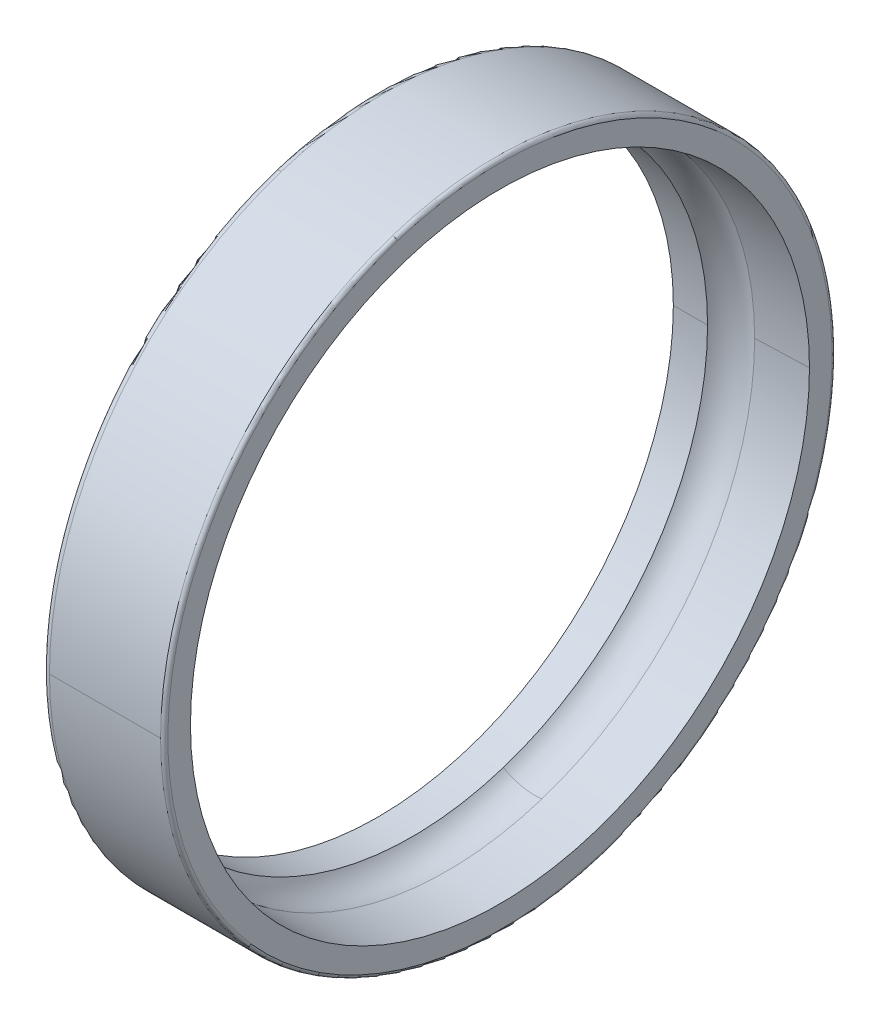
ISO-10303-21;
HEADER;
FILE_DESCRIPTION(('STEP AP214'),'2;1');
FILE_NAME('part.step','',(''),(''),'','','');
FILE_SCHEMA(('AUTOMOTIVE_DESIGN { 1 0 10303 214 1 1 1 1 }'));
ENDSEC;
DATA;
#1=APPLICATION_CONTEXT('core data for automotive mechanical design processes');
#2=APPLICATION_PROTOCOL_DEFINITION('international standard','automotive_design',2000,#1);
#3=PRODUCT_CONTEXT('',#1,'mechanical');
#4=PRODUCT('Part','Part','',(#3));
#5=PRODUCT_RELATED_PRODUCT_CATEGORY('part','',(#4));
#6=PRODUCT_DEFINITION_FORMATION('','',#4);
#7=PRODUCT_DEFINITION_CONTEXT('part definition',#1,'design');
#8=PRODUCT_DEFINITION('design','',#6,#7);
#9=PRODUCT_DEFINITION_SHAPE('','',#8);
#10=(LENGTH_UNIT() NAMED_UNIT(*) SI_UNIT(.MILLI.,.METRE.));
#11=(NAMED_UNIT(*) PLANE_ANGLE_UNIT() SI_UNIT($,.RADIAN.));
#12=(NAMED_UNIT(*) SI_UNIT($,.STERADIAN.) SOLID_ANGLE_UNIT());
#13=UNCERTAINTY_MEASURE_WITH_UNIT(LENGTH_MEASURE(1.E-05),#10,'distance_accuracy_value','');
#14=(GEOMETRIC_REPRESENTATION_CONTEXT(3) GLOBAL_UNCERTAINTY_ASSIGNED_CONTEXT((#13)) GLOBAL_UNIT_ASSIGNED_CONTEXT((#10,
#11,#12)) REPRESENTATION_CONTEXT('',''));
#15=CARTESIAN_POINT('',(0.,0.,0.));
#16=DIRECTION('',(0.,0.,1.));
#17=DIRECTION('',(1.,0.,0.));
#18=AXIS2_PLACEMENT_3D('',#15,#16,#17);
#19=CARTESIAN_POINT('',(0.599999999999874,0.,0.));
#20=DIRECTION('',(1.,0.,0.));
#21=DIRECTION('',(0.,-0.309016994374947,0.951056516295154));
#22=AXIS2_PLACEMENT_3D('',#19,#20,#21);
#23=TOROIDAL_SURFACE('',#22,26.9,0.599999999999875);
#24=CARTESIAN_POINT('',(0.599999999999874,-25.5834202883396,-8.31255714868608));
#25=DIRECTION('',(0.,0.309016994374946,-0.951056516295154));
#26=DIRECTION('',(2.09832151654199E-13,-0.951056516295154,-0.309016994374946));
#27=AXIS2_PLACEMENT_3D('',#24,#25,#26);
#28=CIRCLE('',#27,0.599999999999874);
#29=CARTESIAN_POINT('',(0.6,-26.1540541981166,-8.49796734531101));
#30=VERTEX_POINT('',#29);
#31=CARTESIAN_POINT('',(0.,-25.5834202883396,-8.31255714868608));
#32=VERTEX_POINT('',#31);
#33=EDGE_CURVE('E11',#30,#32,#28,.T.);
#34=ORIENTED_EDGE('',*,*,#33,.T.);
#35=CARTESIAN_POINT('',(0.,-25.5834202883396,-8.31255714868615));
#36=CARTESIAN_POINT('',(0.,-25.4474151324198,-8.7311681921886));
#37=CARTESIAN_POINT('',(0.,-25.3011185990981,-9.14643452912641));
#38=CARTESIAN_POINT('',(0.,-24.988333583264,-9.9692919597601));
#39=CARTESIAN_POINT('',(0.,-24.8218451007517,-10.376883053456));
#40=CARTESIAN_POINT('',(0.,-24.4690669921501,-11.1834041674931));
#41=CARTESIAN_POINT('',(0.,-24.2827773660608,-11.5823341878344));
#42=CARTESIAN_POINT('',(0.,-23.890848512775,-12.3705731448039));
#43=CARTESIAN_POINT('',(0.,-23.6852092855786,-12.7598820814321));
#44=CARTESIAN_POINT('',(0.,-23.2550758949378,-13.5279407111042));
#45=CARTESIAN_POINT('',(0.,-23.0305817314935,-13.906690404148));
#46=CARTESIAN_POINT('',(0.,-22.5632794922202,-14.6527181806377));
#47=CARTESIAN_POINT('',(0.,-22.3204714163913,-15.0199962640835));
#48=CARTESIAN_POINT('',(0.,-21.8171262452813,-15.7421959961621));
#49=CARTESIAN_POINT('',(0.,-21.5565891500002,-16.097117644795));
#50=CARTESIAN_POINT('',(0.,-21.0184136108673,-16.7937494753058));
#51=CARTESIAN_POINT('',(0.,-20.7407751670155,-17.1354596571838));
#52=CARTESIAN_POINT('',(0.,-20.1690657822661,-17.8048453429802));
#53=CARTESIAN_POINT('',(0.,-19.8749948413686,-18.1325208468987));
#54=CARTESIAN_POINT('',(0.,-19.2711289062015,-18.7730477781738));
#55=CARTESIAN_POINT('',(0.,-18.9613339119318,-19.0858992055303));
#56=CARTESIAN_POINT('',(0.,-18.3267661930233,-19.6960242970867));
#57=CARTESIAN_POINT('',(0.,-18.0019934683845,-19.9932979612866));
#58=CARTESIAN_POINT('',(0.,-17.3382526947511,-20.5715513682621));
#59=CARTESIAN_POINT('',(0.,-16.9992846457566,-20.8525311110378));
#60=CARTESIAN_POINT('',(0.,-16.3079698271124,-21.3975197703463));
#61=CARTESIAN_POINT('',(0.,-15.9556230574628,-21.6615286868792));
#62=CARTESIAN_POINT('',(0.,-15.2383996317436,-22.1719396730998));
#63=CARTESIAN_POINT('',(0.,-14.8735229756741,-22.4183417427874));
#64=CARTESIAN_POINT('',(0.,-14.1321187969377,-22.8929454311488));
#65=CARTESIAN_POINT('',(0.,-13.7555912742708,-23.1211470498226));
#66=CARTESIAN_POINT('',(0.,-12.991792450122,-23.5588000784689));
#67=CARTESIAN_POINT('',(0.,-12.6045211486401,-23.7682514884414));
#68=CARTESIAN_POINT('',(0.,-11.8201677373475,-24.1678995128928));
#69=CARTESIAN_POINT('',(0.,-11.4230856275367,-24.3580961273716));
#70=CARTESIAN_POINT('',(0.,-10.6200672051692,-24.7187763605321));
#71=CARTESIAN_POINT('',(0.,-10.2141308926125,-24.8892599792138));
#72=CARTESIAN_POINT('',(0.,-9.39438200088572,-25.2101035108099));
#73=CARTESIAN_POINT('',(0.,-8.98056942171572,-25.3604634237243));
#74=CARTESIAN_POINT('',(0.,-8.1460649075114,-25.6406973135858));
#75=CARTESIAN_POINT('',(0.,-7.72537297247708,-25.7705712905328));
#76=CARTESIAN_POINT('',(0.,-6.87812323026387,-26.0095204306734));
#77=CARTESIAN_POINT('',(0.,-6.45156542308499,-26.118595593867));
#78=CARTESIAN_POINT('',(0.,-5.59361155170219,-26.3156843348786));
#79=CARTESIAN_POINT('',(0.,-5.16221548749829,-26.4036979126967));
#80=CARTESIAN_POINT('',(0.,-4.29562437296996,-26.5584514505394));
#81=CARTESIAN_POINT('',(0.,-3.86042932264553,-26.625191410564));
#82=CARTESIAN_POINT('',(0.,-2.98728865887098,-26.7372369304103));
#83=CARTESIAN_POINT('',(0.,-2.54934304542085,-26.7825424902319));
#84=CARTESIAN_POINT('',(0.,-1.67175630473719,-26.8516100646104));
#85=CARTESIAN_POINT('',(0.,-1.23211517750366,-26.8753720791672));
#86=CARTESIAN_POINT('',(0.,-0.352196543236725,-26.9012953182416));
#87=CARTESIAN_POINT('',(0.,0.0880809637966727,-26.9034565427592));
#88=CARTESIAN_POINT('',(0.,0.96821169058515,-26.8861729951759));
#89=CARTESIAN_POINT('',(0.,1.40806491034023,-26.8667282230751));
#90=CARTESIAN_POINT('',(0.,2.28628741763908,-26.8062795264143));
#91=CARTESIAN_POINT('',(0.,2.72465670518286,-26.7652756018543));
#92=CARTESIAN_POINT('',(0.,3.5988552780488,-26.6618073823208));
#93=CARTESIAN_POINT('',(0.,4.03468456337097,-26.5993430873473));
#94=CARTESIAN_POINT('',(0.,4.90275318087121,-26.4531046089447));
#95=CARTESIAN_POINT('',(0.,5.33499251304929,-26.3693304255156));
#96=CARTESIAN_POINT('',(0.,6.19483992185044,-26.1806739895474));
#97=CARTESIAN_POINT('',(0.,6.62244799847352,-26.0757917370082));
#98=CARTESIAN_POINT('',(0.,7.47200275085404,-25.845171833353));
#99=CARTESIAN_POINT('',(0.,7.89394942661148,-25.7194341822369));
#100=CARTESIAN_POINT('',(0.,8.73116487076068,-25.4474063944424));
#101=CARTESIAN_POINT('',(0.,9.14643363915243,-25.3011162577641));
#102=CARTESIAN_POINT('',(0.,9.96929284973394,-24.988335924598));
#103=CARTESIAN_POINT('',(0.,10.3768832919237,-24.8218457281103));
#104=CARTESIAN_POINT('',(0.,11.1834039290253,-24.4690663647916));
#105=CARTESIAN_POINT('',(0.,11.5823341239371,-24.2827771979606));
#106=CARTESIAN_POINT('',(0.,12.3705732087011,-23.8908486808753));
#107=CARTESIAN_POINT('',(0.,12.7598820985533,-23.6852093306209));
#108=CARTESIAN_POINT('',(0.,13.5279406939829,-23.2550758498956));
#109=CARTESIAN_POINT('',(0.,13.9066903995603,-23.0305817194245));
#110=CARTESIAN_POINT('',(0.,14.6527181852252,-22.5632795042893));
#111=CARTESIAN_POINT('',(0.,15.0199962653127,-22.3204714196252));
#112=CARTESIAN_POINT('',(0.,15.7421959949328,-21.8171262420474));
#113=CARTESIAN_POINT('',(0.,16.0971176444656,-21.5565891491337));
#114=CARTESIAN_POINT('',(0.,16.7937494756351,-21.0184136117338));
#115=CARTESIAN_POINT('',(0.,17.135459657272,-20.7407751672477));
#116=CARTESIAN_POINT('',(0.,17.8048453428919,-20.169065782034));
#117=CARTESIAN_POINT('',(0.,18.132520846875,-19.8749948413064));
#118=CARTESIAN_POINT('',(0.,18.7730477781974,-19.2711289062637));
#119=CARTESIAN_POINT('',(0.,19.0858992055366,-18.9613339119485));
#120=CARTESIAN_POINT('',(0.,19.6960242970804,-18.3267661930067));
#121=CARTESIAN_POINT('',(0.,19.9932979612848,-18.0019934683801));
#122=CARTESIAN_POINT('',(0.,20.5715513682637,-17.3382526947556));
#123=CARTESIAN_POINT('',(0.,20.8525311110382,-16.9992846457578));
#124=CARTESIAN_POINT('',(0.,21.3975197703459,-16.3079698271113));
#125=CARTESIAN_POINT('',(0.,21.6615286868791,-15.9556230574625));
#126=CARTESIAN_POINT('',(0.,22.1719396730998,-15.238399631744));
#127=CARTESIAN_POINT('',(0.,22.4183417427874,-14.8735229756742));
#128=CARTESIAN_POINT('',(0.,22.8929454311488,-14.1321187969377));
#129=CARTESIAN_POINT('',(0.,23.1211470498226,-13.7555912742708));
#130=CARTESIAN_POINT('',(0.,23.5588000784689,-12.9917924501221));
#131=CARTESIAN_POINT('',(0.,23.7682514884414,-12.6045211486402));
#132=CARTESIAN_POINT('',(0.,24.1678995128928,-11.8201677373475));
#133=CARTESIAN_POINT('',(0.,24.3580961273716,-11.4230856275368));
#134=CARTESIAN_POINT('',(0.,24.7187763605321,-10.6200672051693));
#135=CARTESIAN_POINT('',(0.,24.8892599792139,-10.2141308926125));
#136=CARTESIAN_POINT('',(0.,25.2101035108098,-9.39438200088582));
#137=CARTESIAN_POINT('',(0.,25.3604634237239,-8.98056942171588));
#138=CARTESIAN_POINT('',(0.,25.6406973135861,-8.14606490751138));
#139=CARTESIAN_POINT('',(0.,25.770571290534,-7.72537297247681));
#140=CARTESIAN_POINT('',(0.,26.0095204306722,-6.87812323026428));
#141=CARTESIAN_POINT('',(0.,26.1185955938624,-6.45156542308631));
#142=CARTESIAN_POINT('',(0.,26.3156843348832,-5.59361155170101));
#143=CARTESIAN_POINT('',(0.,26.4036979127139,-5.16221548749369));
#144=CARTESIAN_POINT('',(0.,26.5584514505222,-4.2956243729747));
#145=CARTESIAN_POINT('',(0.,26.6251914104998,-3.86042932266304));
#146=CARTESIAN_POINT('',(0.,26.7372369304745,-2.98728865885362));
#147=CARTESIAN_POINT('',(0.,26.7825424904716,-2.54934304535585));
#148=CARTESIAN_POINT('',(0.,26.8516100643707,-1.67175630480234));
#149=CARTESIAN_POINT('',(0.,26.8753720782725,-1.2321151777466));
#150=CARTESIAN_POINT('',(0.,26.9012953191362,-0.352196542993962));
#151=CARTESIAN_POINT('',(0.,26.903456546098,0.0880809647029341));
#152=CARTESIAN_POINT('',(0.,26.8861729918371,0.968211689678711));
#153=CARTESIAN_POINT('',(0.,26.8667282106145,1.40806490695759));
#154=CARTESIAN_POINT('',(0.,26.8062795388749,2.28628742102156));
#155=CARTESIAN_POINT('',(0.,26.7652756483579,2.72465671780665));
#156=CARTESIAN_POINT('',(0.,26.6618073358172,3.59885526542489));
#157=CARTESIAN_POINT('',(0.,26.5993429137935,4.03468451625804));
#158=CARTESIAN_POINT('',(0.,26.4531047824985,4.90275322798401));
#159=CARTESIAN_POINT('',(0.,26.3693310732272,5.33499268887683));
#160=CARTESIAN_POINT('',(0.,26.1806733418358,6.19483974602276));
#161=CARTESIAN_POINT('',(0.,26.0757893197157,6.62244734227587));
#162=CARTESIAN_POINT('',(0.,25.8451742506456,7.47200340705155));
#163=CARTESIAN_POINT('',(0.,25.7194432036955,7.89395187557412));
#164=CARTESIAN_POINT('',(0.,25.5834202883397,8.31255714868601));
#165=B_SPLINE_CURVE_WITH_KNOTS('',3,(#35,#36,#37,#38,#39,#40,#41,#42,#43,#44,#45,#46,#47,#48,
#49,#50,#51,#52,#53,#54,#55,#56,#57,#58,#59,#60,#61,#62,#63,#64,#65,#66,#67,#68,#69,#70,#71,#72,
#73,#74,#75,#76,#77,#78,#79,#80,#81,#82,#83,#84,#85,#86,#87,#88,#89,#90,#91,#92,#93,#94,#95,#96,
#97,#98,#99,#100,#101,#102,#103,#104,#105,#106,#107,#108,#109,#110,#111,#112,#113,#114,#115,
#116,#117,#118,#119,#120,#121,#122,#123,#124,#125,#126,#127,#128,#129,#130,#131,#132,#133,#134,
#135,#136,#137,#138,#139,#140,#141,#142,#143,#144,#145,#146,#147,#148,#149,#150,#151,#152,#153,
#154,#155,#156,#157,#158,#159,#160,#161,#162,#163,#164),.UNSPECIFIED.,.F.,.F.,(4,2,2,2,2,2,2,2,
2,2,2,2,2,2,2,2,2,2,2,2,2,2,2,2,2,2,2,2,2,2,2,2,2,2,2,2,2,2,2,2,2,2,2,2,2,2,2,2,2,2,2,2,2,2,2,2,
2,2,2,2,2,2,2,2,4),(0.,1.32031809453268,2.64063618906536,3.96095428359803,5.28127237813072,
6.60159047266339,7.92190856719607,9.24222666172875,10.5625447562614,11.8828628507941,
13.2031809453268,14.5234990398595,15.8438171343921,17.1641352289248,18.4844533234575,
19.8047714179902,21.1250895125229,22.4454076070555,23.7657257015882,25.0860437961209,
26.4063618906536,27.7266799851863,29.0469980797189,30.3673161742516,31.6876342687843,
33.007952363317,34.3282704578497,35.6485885523823,36.968906646915,38.2892247414477,
39.6095428359804,40.9298609305131,42.2501790250457,43.5704971195784,44.8908152141111,
46.2111333086438,47.5314514031765,48.8517694977091,50.1720875922418,51.4924056867745,
52.8127237813072,54.1330418758398,55.4533599703725,56.7736780649052,58.0939961594379,
59.4143142539706,60.7346323485032,62.0549504430359,63.3752685375686,64.6955866321013,
66.015904726634,67.3362228211666,68.6565409156993,69.976859010232,71.2971771047647,
72.6174951992973,73.93781329383,75.2581313883627,76.5784494828954,77.898767577428,
79.2190856719607,80.5394037664934,81.8597218610261,83.1800399555588,84.5003580500914),.UNSPECIFIED.);
#166=CARTESIAN_POINT('',(0.,25.5834202883396,8.31255714868608));
#167=VERTEX_POINT('',#166);
#168=EDGE_CURVE('E26',#32,#167,#165,.T.);
#169=ORIENTED_EDGE('',*,*,#168,.T.);
#170=CARTESIAN_POINT('',(0.599999999999874,25.5834202883396,8.31255714868608));
#171=DIRECTION('',(0.,-0.309016994374946,0.951056516295154));
#172=DIRECTION('',(2.09832151654199E-13,0.951056516295154,0.309016994374946));
#173=AXIS2_PLACEMENT_3D('',#170,#171,#172);
#174=CIRCLE('',#173,0.599999999999874);
#175=CARTESIAN_POINT('',(0.6,26.1540541981166,8.49796734531101));
#176=VERTEX_POINT('',#175);
#177=EDGE_CURVE('E299',#176,#167,#174,.T.);
#178=ORIENTED_EDGE('',*,*,#177,.F.);
#179=CARTESIAN_POINT('',(0.6,0.,0.));
#180=DIRECTION('',(1.,0.,0.));
#181=DIRECTION('',(0.,0.,-1.));
#182=AXIS2_PLACEMENT_3D('',#179,#180,#181);
#183=CIRCLE('',#182,27.5);
#184=CARTESIAN_POINT('',(0.6,0.,-27.5));
#185=VERTEX_POINT('',#184);
#186=EDGE_CURVE('E294',#185,#176,#183,.T.);
#187=ORIENTED_EDGE('',*,*,#186,.F.);
#188=CARTESIAN_POINT('',(0.6,0.,0.));
#189=DIRECTION('',(1.,0.,0.));
#190=DIRECTION('',(0.,0.,-1.));
#191=AXIS2_PLACEMENT_3D('',#188,#189,#190);
#192=CIRCLE('',#191,27.5);
#193=EDGE_CURVE('E289',#30,#185,#192,.T.);
#194=ORIENTED_EDGE('',*,*,#193,.F.);
#195=EDGE_LOOP('',(#34,#169,#178,#187,#194));
#196=FACE_BOUND('',#195,.T.);
#197=ADVANCED_FACE('F17',(#196),#23,.T.);
#198=CARTESIAN_POINT('',(50.,0.,0.));
#199=DIRECTION('',(1.,0.,0.));
#200=DIRECTION('',(0.,1.,0.));
#201=AXIS2_PLACEMENT_3D('',#198,#199,#200);
#202=CYLINDRICAL_SURFACE('',#201,27.5);
#203=DIRECTION('',(1.,0.,0.));
#204=VECTOR('',#203,1.);
#205=CARTESIAN_POINT('',(0.600000000000001,0.,27.5));
#206=LINE('',#205,#204);
#207=CARTESIAN_POINT('',(0.600000000000001,0.,27.5));
#208=VERTEX_POINT('',#207);
#209=CARTESIAN_POINT('',(9.7,0.,27.5));
#210=VERTEX_POINT('',#209);
#211=EDGE_CURVE('E284',#208,#210,#206,.T.);
#212=ORIENTED_EDGE('',*,*,#211,.F.);
#213=CARTESIAN_POINT('',(0.6,0.,0.));
#214=DIRECTION('',(1.,0.,0.));
#215=DIRECTION('',(0.,0.,-1.));
#216=AXIS2_PLACEMENT_3D('',#213,#214,#215);
#217=CIRCLE('',#216,27.5);
#218=EDGE_CURVE('E279',#208,#30,#217,.T.);
#219=ORIENTED_EDGE('',*,*,#218,.T.);
#220=ORIENTED_EDGE('',*,*,#193,.T.);
#221=DIRECTION('',(1.,0.,0.));
#222=VECTOR('',#221,1.);
#223=CARTESIAN_POINT('',(0.600000000000001,0.,-27.5));
#224=LINE('',#223,#222);
#225=CARTESIAN_POINT('',(9.7,0.,-27.5));
#226=VERTEX_POINT('',#225);
#227=EDGE_CURVE('E275',#185,#226,#224,.T.);
#228=ORIENTED_EDGE('',*,*,#227,.T.);
#229=CARTESIAN_POINT('',(9.7,0.,0.));
#230=DIRECTION('',(1.,0.,0.));
#231=DIRECTION('',(0.,0.,-1.));
#232=AXIS2_PLACEMENT_3D('',#229,#230,#231);
#233=CIRCLE('',#232,27.5);
#234=CARTESIAN_POINT('',(9.7,-26.1540541981166,-8.49796734531101));
#235=VERTEX_POINT('',#234);
#236=EDGE_CURVE('E270',#235,#226,#233,.T.);
#237=ORIENTED_EDGE('',*,*,#236,.F.);
#238=CARTESIAN_POINT('',(9.7,0.,0.));
#239=DIRECTION('',(1.,0.,0.));
#240=DIRECTION('',(0.,0.,-1.));
#241=AXIS2_PLACEMENT_3D('',#238,#239,#240);
#242=CIRCLE('',#241,27.5);
#243=EDGE_CURVE('E265',#210,#235,#242,.T.);
#244=ORIENTED_EDGE('',*,*,#243,.F.);
#245=EDGE_LOOP('',(#212,#219,#220,#228,#237,#244));
#246=FACE_BOUND('',#245,.T.);
#247=ADVANCED_FACE('F320',(#246),#202,.T.);
#248=CARTESIAN_POINT('',(9.70000000000012,0.,0.));
#249=DIRECTION('',(1.,0.,0.));
#250=DIRECTION('',(0.,0.309016994374947,-0.951056516295154));
#251=AXIS2_PLACEMENT_3D('',#248,#249,#250);
#252=TOROIDAL_SURFACE('',#251,27.2,0.299999999999878);
#253=CARTESIAN_POINT('',(9.70000000000012,-25.8687372432282,-8.40526224699856));
#254=DIRECTION('',(0.,0.309016994374947,-0.951056516295154));
#255=DIRECTION('',(1.,0.,0.));
#256=AXIS2_PLACEMENT_3D('',#253,#254,#255);
#257=CIRCLE('',#256,0.299999999999878);
#258=CARTESIAN_POINT('',(10.,-25.8687372432282,-8.40526224699856));
#259=VERTEX_POINT('',#258);
#260=EDGE_CURVE('E260',#259,#235,#257,.T.);
#261=ORIENTED_EDGE('',*,*,#260,.F.);
#262=CARTESIAN_POINT('',(10.,0.,0.));
#263=DIRECTION('',(1.,0.,0.));
#264=DIRECTION('',(0.,0.,-1.));
#265=AXIS2_PLACEMENT_3D('',#262,#263,#264);
#266=CIRCLE('',#265,27.2);
#267=CARTESIAN_POINT('',(10.,25.8687372432282,8.40526224699857));
#268=VERTEX_POINT('',#267);
#269=EDGE_CURVE('E255',#268,#259,#266,.T.);
#270=ORIENTED_EDGE('',*,*,#269,.F.);
#271=CARTESIAN_POINT('',(9.70000000000012,25.8687372432282,8.40526224699857));
#272=DIRECTION('',(0.,-0.309016994374947,0.951056516295154));
#273=DIRECTION('',(1.,0.,0.));
#274=AXIS2_PLACEMENT_3D('',#271,#272,#273);
#275=CIRCLE('',#274,0.299999999999878);
#276=CARTESIAN_POINT('',(9.7,26.1540541981166,8.49796734531101));
#277=VERTEX_POINT('',#276);
#278=EDGE_CURVE('E251',#268,#277,#275,.T.);
#279=ORIENTED_EDGE('',*,*,#278,.T.);
#280=CARTESIAN_POINT('',(9.7,0.,0.));
#281=DIRECTION('',(1.,0.,0.));
#282=DIRECTION('',(0.,0.,-1.));
#283=AXIS2_PLACEMENT_3D('',#280,#281,#282);
#284=CIRCLE('',#283,27.5);
#285=EDGE_CURVE('E246',#277,#210,#284,.T.);
#286=ORIENTED_EDGE('',*,*,#285,.T.);
#287=ORIENTED_EDGE('',*,*,#243,.T.);
#288=EDGE_LOOP('',(#261,#270,#279,#286,#287));
#289=FACE_BOUND('',#288,.T.);
#290=ADVANCED_FACE('F322',(#289),#252,.T.);
#291=CARTESIAN_POINT('',(50.,0.,0.));
#292=DIRECTION('',(1.,0.,0.));
#293=DIRECTION('',(0.,-1.,0.));
#294=AXIS2_PLACEMENT_3D('',#291,#292,#293);
#295=CYLINDRICAL_SURFACE('',#294,27.5);
#296=ORIENTED_EDGE('',*,*,#211,.T.);
#297=ORIENTED_EDGE('',*,*,#285,.F.);
#298=CARTESIAN_POINT('',(9.7,0.,0.));
#299=DIRECTION('',(1.,0.,0.));
#300=DIRECTION('',(0.,0.,-1.));
#301=AXIS2_PLACEMENT_3D('',#298,#299,#300);
#302=CIRCLE('',#301,27.5);
#303=EDGE_CURVE('E241',#226,#277,#302,.T.);
#304=ORIENTED_EDGE('',*,*,#303,.F.);
#305=ORIENTED_EDGE('',*,*,#227,.F.);
#306=ORIENTED_EDGE('',*,*,#186,.T.);
#307=CARTESIAN_POINT('',(0.6,0.,0.));
#308=DIRECTION('',(1.,0.,0.));
#309=DIRECTION('',(0.,0.,-1.));
#310=AXIS2_PLACEMENT_3D('',#307,#308,#309);
#311=CIRCLE('',#310,27.5);
#312=EDGE_CURVE('E238',#176,#208,#311,.T.);
#313=ORIENTED_EDGE('',*,*,#312,.T.);
#314=EDGE_LOOP('',(#296,#297,#304,#305,#306,#313));
#315=FACE_BOUND('',#314,.T.);
#316=ADVANCED_FACE('F316',(#315),#295,.T.);
#317=CARTESIAN_POINT('',(0.599999999999874,0.,0.));
#318=DIRECTION('',(1.,0.,0.));
#319=DIRECTION('',(0.,0.309016994374947,-0.951056516295154));
#320=AXIS2_PLACEMENT_3D('',#317,#318,#319);
#321=TOROIDAL_SURFACE('',#320,26.9,0.599999999999875);
#322=ORIENTED_EDGE('',*,*,#33,.F.);
#323=ORIENTED_EDGE('',*,*,#218,.F.);
#324=ORIENTED_EDGE('',*,*,#312,.F.);
#325=ORIENTED_EDGE('',*,*,#177,.T.);
#326=CARTESIAN_POINT('',(0.,25.5834202883396,8.31255714868615));
#327=CARTESIAN_POINT('',(0.,25.4474151324198,8.7311681921886));
#328=CARTESIAN_POINT('',(0.,25.3011185990981,9.14643452912641));
#329=CARTESIAN_POINT('',(0.,24.988333583264,9.9692919597601));
#330=CARTESIAN_POINT('',(0.,24.8218451007517,10.376883053456));
#331=CARTESIAN_POINT('',(0.,24.4690669921501,11.1834041674931));
#332=CARTESIAN_POINT('',(0.,24.2827773660608,11.5823341878344));
#333=CARTESIAN_POINT('',(0.,23.890848512775,12.3705731448039));
#334=CARTESIAN_POINT('',(0.,23.6852092855786,12.7598820814321));
#335=CARTESIAN_POINT('',(0.,23.2550758949378,13.5279407111042));
#336=CARTESIAN_POINT('',(0.,23.0305817314935,13.906690404148));
#337=CARTESIAN_POINT('',(0.,22.5632794922202,14.6527181806377));
#338=CARTESIAN_POINT('',(0.,22.3204714163913,15.0199962640835));
#339=CARTESIAN_POINT('',(0.,21.8171262452813,15.7421959961622));
#340=CARTESIAN_POINT('',(0.,21.5565891500002,16.097117644795));
#341=CARTESIAN_POINT('',(0.,21.0184136108673,16.7937494753058));
#342=CARTESIAN_POINT('',(0.,20.7407751670155,17.1354596571838));
#343=CARTESIAN_POINT('',(0.,20.1690657822661,17.8048453429802));
#344=CARTESIAN_POINT('',(0.,19.8749948413686,18.1325208468987));
#345=CARTESIAN_POINT('',(0.,19.2711289062014,18.7730477781738));
#346=CARTESIAN_POINT('',(0.,18.9613339119318,19.0858992055304));
#347=CARTESIAN_POINT('',(0.,18.3267661930233,19.6960242970868));
#348=CARTESIAN_POINT('',(0.,18.0019934683845,19.9932979612866));
#349=CARTESIAN_POINT('',(0.,17.3382526947511,20.5715513682621));
#350=CARTESIAN_POINT('',(0.,16.9992846457566,20.8525311110378));
#351=CARTESIAN_POINT('',(0.,16.3079698271124,21.3975197703464));
#352=CARTESIAN_POINT('',(0.,15.9556230574628,21.6615286868792));
#353=CARTESIAN_POINT('',(0.,15.2383996317436,22.1719396730998));
#354=CARTESIAN_POINT('',(0.,14.8735229756741,22.4183417427874));
#355=CARTESIAN_POINT('',(0.,14.1321187969377,22.8929454311489));
#356=CARTESIAN_POINT('',(0.,13.7555912742707,23.1211470498226));
#357=CARTESIAN_POINT('',(0.,12.991792450122,23.5588000784689));
#358=CARTESIAN_POINT('',(0.,12.6045211486401,23.7682514884414));
#359=CARTESIAN_POINT('',(0.,11.8201677373474,24.1678995128928));
#360=CARTESIAN_POINT('',(0.,11.4230856275367,24.3580961273717));
#361=CARTESIAN_POINT('',(0.,10.6200672051692,24.7187763605321));
#362=CARTESIAN_POINT('',(0.,10.2141308926125,24.8892599792138));
#363=CARTESIAN_POINT('',(0.,9.3943820008857,25.2101035108099));
#364=CARTESIAN_POINT('',(0.,8.9805694217157,25.3604634237243));
#365=CARTESIAN_POINT('',(0.,8.14606490751138,25.6406973135858));
#366=CARTESIAN_POINT('',(0.,7.72537297247705,25.7705712905328));
#367=CARTESIAN_POINT('',(0.,6.87812323026384,26.0095204306734));
#368=CARTESIAN_POINT('',(0.,6.45156542308496,26.118595593867));
#369=CARTESIAN_POINT('',(0.,5.59361155170216,26.3156843348787));
#370=CARTESIAN_POINT('',(0.,5.16221548749825,26.4036979126968));
#371=CARTESIAN_POINT('',(0.,4.29562437296992,26.5584514505394));
#372=CARTESIAN_POINT('',(0.,3.86042932264549,26.625191410564));
#373=CARTESIAN_POINT('',(0.,2.98728865887094,26.7372369304103));
#374=CARTESIAN_POINT('',(0.,2.54934304542081,26.7825424902319));
#375=CARTESIAN_POINT('',(0.,1.67175630473715,26.8516100646104));
#376=CARTESIAN_POINT('',(0.,1.23211517750363,26.8753720791672));
#377=CARTESIAN_POINT('',(0.,0.352196543236694,26.9012953182416));
#378=CARTESIAN_POINT('',(0.,-0.0880809637967076,26.9034565427592));
#379=CARTESIAN_POINT('',(0.,-0.968211690585189,26.8861729951759));
#380=CARTESIAN_POINT('',(0.,-1.40806491034027,26.8667282230751));
#381=CARTESIAN_POINT('',(0.,-2.28628741763913,26.8062795264143));
#382=CARTESIAN_POINT('',(0.,-2.72465670518291,26.7652756018543));
#383=CARTESIAN_POINT('',(0.,-3.59885527804885,26.6618073823208));
#384=CARTESIAN_POINT('',(0.,-4.03468456337102,26.5993430873473));
#385=CARTESIAN_POINT('',(0.,-4.90275318087126,26.4531046089447));
#386=CARTESIAN_POINT('',(0.,-5.33499251304934,26.3693304255156));
#387=CARTESIAN_POINT('',(0.,-6.19483992185049,26.1806739895473));
#388=CARTESIAN_POINT('',(0.,-6.62244799847357,26.0757917370082));
#389=CARTESIAN_POINT('',(0.,-7.47200275085409,25.845171833353));
#390=CARTESIAN_POINT('',(0.,-7.89394942661153,25.7194341822368));
#391=CARTESIAN_POINT('',(0.,-8.73116487076073,25.4474063944424));
#392=CARTESIAN_POINT('',(0.,-9.14643363915249,25.3011162577641));
#393=CARTESIAN_POINT('',(0.,-9.96929284973399,24.988335924598));
#394=CARTESIAN_POINT('',(0.,-10.3768832919237,24.8218457281103));
#395=CARTESIAN_POINT('',(0.,-11.1834039290253,24.4690663647916));
#396=CARTESIAN_POINT('',(0.,-11.5823341239371,24.2827771979606));
#397=CARTESIAN_POINT('',(0.,-12.3705732087011,23.8908486808753));
#398=CARTESIAN_POINT('',(0.,-12.7598820985533,23.6852093306209));
#399=CARTESIAN_POINT('',(0.,-13.5279406939829,23.2550758498955));
#400=CARTESIAN_POINT('',(0.,-13.9066903995604,23.0305817194245));
#401=CARTESIAN_POINT('',(0.,-14.6527181852253,22.5632795042893));
#402=CARTESIAN_POINT('',(0.,-15.0199962653127,22.3204714196252));
#403=CARTESIAN_POINT('',(0.,-15.7421959949329,21.8171262420474));
#404=CARTESIAN_POINT('',(0.,-16.0971176444656,21.5565891491337));
#405=CARTESIAN_POINT('',(0.,-16.7937494756352,21.0184136117338));
#406=CARTESIAN_POINT('',(0.,-17.135459657272,20.7407751672477));
#407=CARTESIAN_POINT('',(0.,-17.8048453428919,20.169065782034));
#408=CARTESIAN_POINT('',(0.,-18.132520846875,19.8749948413064));
#409=CARTESIAN_POINT('',(0.,-18.7730477781974,19.2711289062637));
#410=CARTESIAN_POINT('',(0.,-19.0858992055367,18.9613339119485));
#411=CARTESIAN_POINT('',(0.,-19.6960242970804,18.3267661930067));
#412=CARTESIAN_POINT('',(0.,-19.9932979612849,18.00199346838));
#413=CARTESIAN_POINT('',(0.,-20.5715513682638,17.3382526947556));
#414=CARTESIAN_POINT('',(0.,-20.8525311110382,16.9992846457578));
#415=CARTESIAN_POINT('',(0.,-21.3975197703459,16.3079698271112));
#416=CARTESIAN_POINT('',(0.,-21.6615286868791,15.9556230574625));
#417=CARTESIAN_POINT('',(0.,-22.1719396730999,15.2383996317439));
#418=CARTESIAN_POINT('',(0.,-22.4183417427874,14.8735229756742));
#419=CARTESIAN_POINT('',(0.,-22.8929454311488,14.1321187969376));
#420=CARTESIAN_POINT('',(0.,-23.1211470498226,13.7555912742708));
#421=CARTESIAN_POINT('',(0.,-23.5588000784689,12.991792450122));
#422=CARTESIAN_POINT('',(0.,-23.7682514884414,12.6045211486401));
#423=CARTESIAN_POINT('',(0.,-24.1678995128928,11.8201677373475));
#424=CARTESIAN_POINT('',(0.,-24.3580961273716,11.4230856275367));
#425=CARTESIAN_POINT('',(0.,-24.7187763605322,10.6200672051692));
#426=CARTESIAN_POINT('',(0.,-24.8892599792139,10.2141308926124));
#427=CARTESIAN_POINT('',(0.,-25.2101035108098,9.39438200088575));
#428=CARTESIAN_POINT('',(0.,-25.360463423724,8.98056942171581));
#429=CARTESIAN_POINT('',(0.,-25.6406973135861,8.14606490751131));
#430=CARTESIAN_POINT('',(0.,-25.7705712905341,7.72537297247674));
#431=CARTESIAN_POINT('',(0.,-26.0095204306722,6.87812323026421));
#432=CARTESIAN_POINT('',(0.,-26.1185955938624,6.45156542308624));
#433=CARTESIAN_POINT('',(0.,-26.3156843348833,5.59361155170094));
#434=CARTESIAN_POINT('',(0.,-26.403697912714,5.16221548749362));
#435=CARTESIAN_POINT('',(0.,-26.5584514505222,4.29562437297462));
#436=CARTESIAN_POINT('',(0.,-26.6251914104998,3.86042932266295));
#437=CARTESIAN_POINT('',(0.,-26.7372369304745,2.98728865885352));
#438=CARTESIAN_POINT('',(0.,-26.7825424904716,2.54934304535575));
#439=CARTESIAN_POINT('',(0.,-26.8516100643707,1.67175630480225));
#440=CARTESIAN_POINT('',(0.,-26.8753720782725,1.2321151777465));
#441=CARTESIAN_POINT('',(0.,-26.9012953191362,0.352196542993864));
#442=CARTESIAN_POINT('',(0.,-26.903456546098,-0.0880809647030333));
#443=CARTESIAN_POINT('',(0.,-26.8861729918371,-0.968211689678811));
#444=CARTESIAN_POINT('',(0.,-26.8667282106145,-1.40806490695769));
#445=CARTESIAN_POINT('',(0.,-26.8062795388749,-2.28628742102166));
#446=CARTESIAN_POINT('',(0.,-26.7652756483579,-2.72465671780675));
#447=CARTESIAN_POINT('',(0.,-26.6618073358172,-3.59885526542498));
#448=CARTESIAN_POINT('',(0.,-26.5993429137935,-4.03468451625814));
#449=CARTESIAN_POINT('',(0.,-26.4531047824985,-4.90275322798411));
#450=CARTESIAN_POINT('',(0.,-26.3693310732272,-5.33499268887693));
#451=CARTESIAN_POINT('',(0.,-26.1806733418358,-6.19483974602286));
#452=CARTESIAN_POINT('',(0.,-26.0757893197157,-6.62244734227596));
#453=CARTESIAN_POINT('',(0.,-25.8451742506455,-7.47200340705164));
#454=CARTESIAN_POINT('',(0.,-25.7194432036954,-7.89395187557421));
#455=CARTESIAN_POINT('',(0.,-25.5834202883396,-8.3125571486861));
#456=B_SPLINE_CURVE_WITH_KNOTS('',3,(#326,#327,#328,#329,#330,#331,#332,#333,#334,#335,#336,
#337,#338,#339,#340,#341,#342,#343,#344,#345,#346,#347,#348,#349,#350,#351,#352,#353,#354,#355,
#356,#357,#358,#359,#360,#361,#362,#363,#364,#365,#366,#367,#368,#369,#370,#371,#372,#373,#374,
#375,#376,#377,#378,#379,#380,#381,#382,#383,#384,#385,#386,#387,#388,#389,#390,#391,#392,#393,
#394,#395,#396,#397,#398,#399,#400,#401,#402,#403,#404,#405,#406,#407,#408,#409,#410,#411,#412,
#413,#414,#415,#416,#417,#418,#419,#420,#421,#422,#423,#424,#425,#426,#427,#428,#429,#430,#431,
#432,#433,#434,#435,#436,#437,#438,#439,#440,#441,#442,#443,#444,#445,#446,#447,#448,#449,#450,
#451,#452,#453,#454,#455),.UNSPECIFIED.,.F.,.F.,(4,2,2,2,2,2,2,2,2,2,2,2,2,2,2,2,2,2,2,2,2,2,2,
2,2,2,2,2,2,2,2,2,2,2,2,2,2,2,2,2,2,2,2,2,2,2,2,2,2,2,2,2,2,2,2,2,2,2,2,2,2,2,2,2,4),(0.,
1.32031809453268,2.64063618906536,3.96095428359804,5.28127237813072,6.6015904726634,
7.92190856719608,9.24222666172876,10.5625447562615,11.8828628507941,13.2031809453268,
14.5234990398595,15.8438171343922,17.1641352289248,18.4844533234575,19.8047714179902,
21.1250895125229,22.4454076070556,23.7657257015883,25.0860437961209,26.4063618906536,
27.7266799851863,29.046998079719,30.3673161742516,31.6876342687843,33.007952363317,
34.3282704578497,35.6485885523824,36.9689066469151,38.2892247414477,39.6095428359804,
40.9298609305131,42.2501790250458,43.5704971195785,44.8908152141111,46.2111333086438,
47.5314514031765,48.8517694977092,50.1720875922419,51.4924056867745,52.8127237813072,
54.1330418758399,55.4533599703726,56.7736780649053,58.0939961594379,59.4143142539706,
60.7346323485033,62.054950443036,63.3752685375686,64.6955866321013,66.015904726634,
67.3362228211667,68.6565409156994,69.976859010232,71.2971771047647,72.6174951992974,
73.9378132938301,75.2581313883628,76.5784494828954,77.8987675774281,79.2190856719608,
80.5394037664935,81.8597218610262,83.1800399555588,84.5003580500915),.UNSPECIFIED.);
#457=EDGE_CURVE('E224',#167,#32,#456,.T.);
#458=ORIENTED_EDGE('',*,*,#457,.T.);
#459=EDGE_LOOP('',(#322,#323,#324,#325,#458));
#460=FACE_BOUND('',#459,.T.);
#461=ADVANCED_FACE('F203',(#460),#321,.T.);
#462=CARTESIAN_POINT('',(0.,26.9,0.));
#463=DIRECTION('',(-1.,0.,0.));
#464=DIRECTION('',(0.,0.,1.));
#465=AXIS2_PLACEMENT_3D('',#462,#463,#464);
#466=PLANE('',#465);
#467=CARTESIAN_POINT('',(0.,0.,0.));
#468=DIRECTION('',(1.,0.,0.));
#469=DIRECTION('',(0.,0.,-1.));
#470=AXIS2_PLACEMENT_3D('',#467,#468,#469);
#471=CIRCLE('',#470,24.2);
#472=CARTESIAN_POINT('',(0.,0.,-24.2));
#473=VERTEX_POINT('',#472);
#474=CARTESIAN_POINT('',(0.,0.,24.2));
#475=VERTEX_POINT('',#474);
#476=EDGE_CURVE('E220',#473,#475,#471,.T.);
#477=ORIENTED_EDGE('',*,*,#476,.T.);
#478=CARTESIAN_POINT('',(0.,0.,0.));
#479=DIRECTION('',(1.,0.,0.));
#480=DIRECTION('',(0.,0.,-1.));
#481=AXIS2_PLACEMENT_3D('',#478,#479,#480);
#482=CIRCLE('',#481,24.2);
#483=EDGE_CURVE('E184',#475,#473,#482,.T.);
#484=ORIENTED_EDGE('',*,*,#483,.T.);
#485=EDGE_LOOP('',(#477,#484));
#486=FACE_BOUND('',#485,.T.);
#487=ORIENTED_EDGE('',*,*,#168,.F.);
#488=ORIENTED_EDGE('',*,*,#457,.F.);
#489=EDGE_LOOP('',(#487,#488));
#490=FACE_BOUND('',#489,.T.);
#491=ADVANCED_FACE('F192',(#486,#490),#466,.T.);
#492=CARTESIAN_POINT('',(50.,0.,0.));
#493=DIRECTION('',(1.,0.,0.));
#494=DIRECTION('',(0.,1.,0.));
#495=AXIS2_PLACEMENT_3D('',#492,#493,#494);
#496=CYLINDRICAL_SURFACE('',#495,24.2);
#497=DIRECTION('',(1.,0.,0.));
#498=VECTOR('',#497,1.);
#499=CARTESIAN_POINT('',(0.,0.,24.2));
#500=LINE('',#499,#498);
#501=CARTESIAN_POINT('',(2.8028919007022,0.,24.2));
#502=VERTEX_POINT('',#501);
#503=EDGE_CURVE('E180',#475,#502,#500,.T.);
#504=ORIENTED_EDGE('',*,*,#503,.T.);
#505=CARTESIAN_POINT('',(2.8028919007022,0.,0.));
#506=DIRECTION('',(1.,0.,0.));
#507=DIRECTION('',(0.,0.,-1.));
#508=AXIS2_PLACEMENT_3D('',#505,#506,#507);
#509=CIRCLE('',#508,24.2);
#510=CARTESIAN_POINT('',(2.80289190070219,-23.0155676943427,-7.47821126387372));
#511=VERTEX_POINT('',#510);
#512=EDGE_CURVE('E176',#502,#511,#509,.T.);
#513=ORIENTED_EDGE('',*,*,#512,.T.);
#514=CARTESIAN_POINT('',(2.8028919007022,0.,0.));
#515=DIRECTION('',(1.,0.,0.));
#516=DIRECTION('',(0.,0.,-1.));
#517=AXIS2_PLACEMENT_3D('',#514,#515,#516);
#518=CIRCLE('',#517,24.2);
#519=CARTESIAN_POINT('',(2.8028919007022,0.,-24.2));
#520=VERTEX_POINT('',#519);
#521=EDGE_CURVE('E172',#511,#520,#518,.T.);
#522=ORIENTED_EDGE('',*,*,#521,.T.);
#523=DIRECTION('',(1.,0.,0.));
#524=VECTOR('',#523,1.);
#525=CARTESIAN_POINT('',(0.,0.,-24.2));
#526=LINE('',#525,#524);
#527=EDGE_CURVE('E167',#473,#520,#526,.T.);
#528=ORIENTED_EDGE('',*,*,#527,.F.);
#529=ORIENTED_EDGE('',*,*,#483,.F.);
#530=EDGE_LOOP('',(#504,#513,#522,#528,#529));
#531=FACE_BOUND('',#530,.T.);
#532=ADVANCED_FACE('F202',(#531),#496,.F.);
#533=CARTESIAN_POINT('',(50.,0.,0.));
#534=DIRECTION('',(1.,0.,0.));
#535=DIRECTION('',(0.,-1.,0.));
#536=AXIS2_PLACEMENT_3D('',#533,#534,#535);
#537=CYLINDRICAL_SURFACE('',#536,24.2);
#538=ORIENTED_EDGE('',*,*,#503,.F.);
#539=ORIENTED_EDGE('',*,*,#476,.F.);
#540=ORIENTED_EDGE('',*,*,#527,.T.);
#541=CARTESIAN_POINT('',(2.8028919007022,0.,0.));
#542=DIRECTION('',(1.,0.,0.));
#543=DIRECTION('',(0.,0.,-1.));
#544=AXIS2_PLACEMENT_3D('',#541,#542,#543);
#545=CIRCLE('',#544,24.2);
#546=CARTESIAN_POINT('',(2.80289190070219,23.0155676943427,7.47821126387373));
#547=VERTEX_POINT('',#546);
#548=EDGE_CURVE('E163',#520,#547,#545,.T.);
#549=ORIENTED_EDGE('',*,*,#548,.T.);
#550=CARTESIAN_POINT('',(2.8028919007022,0.,0.));
#551=DIRECTION('',(1.,0.,0.));
#552=DIRECTION('',(0.,0.,-1.));
#553=AXIS2_PLACEMENT_3D('',#550,#551,#552);
#554=CIRCLE('',#553,24.2);
#555=EDGE_CURVE('E158',#547,#502,#554,.T.);
#556=ORIENTED_EDGE('',*,*,#555,.T.);
#557=EDGE_LOOP('',(#538,#539,#540,#549,#556));
#558=FACE_BOUND('',#557,.T.);
#559=ADVANCED_FACE('F376',(#558),#537,.F.);
#560=CARTESIAN_POINT('',(5.00000000000073,0.,0.));
#561=DIRECTION('',(1.,0.,0.));
#562=DIRECTION('',(0.,0.309016994374947,-0.951056516295154));
#563=AXIS2_PLACEMENT_3D('',#560,#561,#562);
#564=TOROIDAL_SURFACE('',#563,22.4999999999979,2.77800000000187);
#565=CARTESIAN_POINT('',(5.00000000000073,-21.398771616639,-6.95288237343566));
#566=DIRECTION('',(0.,0.309016994374947,-0.951056516295154));
#567=DIRECTION('',(0.237601212788995,-0.923820908122369,-0.300167608840728));
#568=AXIS2_PLACEMENT_3D('',#565,#566,#567);
#569=CIRCLE('',#568,2.77800000000187);
#570=CARTESIAN_POINT('',(5.660056169129,-23.9651460994046,-7.78674799079577));
#571=VERTEX_POINT('',#570);
#572=EDGE_CURVE('E130',#571,#511,#569,.T.);
#573=ORIENTED_EDGE('',*,*,#572,.T.);
#574=ORIENTED_EDGE('',*,*,#512,.F.);
#575=ORIENTED_EDGE('',*,*,#555,.F.);
#576=CARTESIAN_POINT('',(5.00000000000073,21.398771616639,6.95288237343567));
#577=DIRECTION('',(0.,-0.309016994374947,0.951056516295154));
#578=DIRECTION('',(0.237601212788997,0.923820908122369,0.300167608840728));
#579=AXIS2_PLACEMENT_3D('',#576,#577,#578);
#580=CIRCLE('',#579,2.77800000000187);
#581=CARTESIAN_POINT('',(5.66005616912901,23.9651460994046,7.78674799079577));
#582=VERTEX_POINT('',#581);
#583=EDGE_CURVE('E151',#582,#547,#580,.T.);
#584=ORIENTED_EDGE('',*,*,#583,.F.);
#585=CARTESIAN_POINT('',(5.660056169129,0.,0.));
#586=DIRECTION('',(1.,0.,0.));
#587=DIRECTION('',(0.,0.,-1.));
#588=AXIS2_PLACEMENT_3D('',#585,#586,#587);
#589=CIRCLE('',#588,25.198445821875);
#590=CARTESIAN_POINT('',(5.660056169129,0.,25.198445821875));
#591=VERTEX_POINT('',#590);
#592=EDGE_CURVE('E122',#582,#591,#589,.T.);
#593=ORIENTED_EDGE('',*,*,#592,.T.);
#594=CARTESIAN_POINT('',(5.660056169129,0.,0.));
#595=DIRECTION('',(1.,0.,0.));
#596=DIRECTION('',(0.,0.,-1.));
#597=AXIS2_PLACEMENT_3D('',#594,#595,#596);
#598=CIRCLE('',#597,25.198445821875);
#599=EDGE_CURVE('E144',#591,#571,#598,.T.);
#600=ORIENTED_EDGE('',*,*,#599,.T.);
#601=EDGE_LOOP('',(#573,#574,#575,#584,#593,#600));
#602=FACE_BOUND('',#601,.T.);
#603=ADVANCED_FACE('F383',(#602),#564,.F.);
#604=CARTESIAN_POINT('',(5.660056169129,0.,0.));
#605=DIRECTION('',(1.,0.,0.));
#606=DIRECTION('',(0.,1.,0.));
#607=AXIS2_PLACEMENT_3D('',#604,#605,#606);
#608=CONICAL_SURFACE('',#607,25.198445821875,0.0349065850398912);
#609=DIRECTION('',(0.999390827019096,0.,0.0348994967025052));
#610=VECTOR('',#609,1.);
#611=CARTESIAN_POINT('',(5.660056169129,0.,25.198445821875));
#612=LINE('',#611,#610);
#613=CARTESIAN_POINT('',(9.99999999999988,0.,25.35));
#614=VERTEX_POINT('',#613);
#615=EDGE_CURVE('E140',#591,#614,#612,.T.);
#616=ORIENTED_EDGE('',*,*,#615,.T.);
#617=CARTESIAN_POINT('',(10.,0.,0.));
#618=DIRECTION('',(1.,0.,0.));
#619=DIRECTION('',(0.,0.,-1.));
#620=AXIS2_PLACEMENT_3D('',#617,#618,#619);
#621=CIRCLE('',#620,25.35);
#622=CARTESIAN_POINT('',(10.,0.,-25.35));
#623=VERTEX_POINT('',#622);
#624=EDGE_CURVE('E112',#614,#623,#621,.T.);
#625=ORIENTED_EDGE('',*,*,#624,.T.);
#626=DIRECTION('',(0.999390827019096,0.,-0.0348994967025052));
#627=VECTOR('',#626,1.);
#628=CARTESIAN_POINT('',(5.660056169129,0.,-25.198445821875));
#629=LINE('',#628,#627);
#630=CARTESIAN_POINT('',(5.660056169129,0.,-25.198445821875));
#631=VERTEX_POINT('',#630);
#632=EDGE_CURVE('E104',#631,#623,#629,.T.);
#633=ORIENTED_EDGE('',*,*,#632,.F.);
#634=CARTESIAN_POINT('',(5.660056169129,0.,0.));
#635=DIRECTION('',(1.,0.,0.));
#636=DIRECTION('',(0.,0.,-1.));
#637=AXIS2_PLACEMENT_3D('',#634,#635,#636);
#638=CIRCLE('',#637,25.198445821875);
#639=EDGE_CURVE('E109',#571,#631,#638,.T.);
#640=ORIENTED_EDGE('',*,*,#639,.F.);
#641=ORIENTED_EDGE('',*,*,#599,.F.);
#642=EDGE_LOOP('',(#616,#625,#633,#640,#641));
#643=FACE_BOUND('',#642,.T.);
#644=ADVANCED_FACE('F106',(#643),#608,.F.);
#645=CARTESIAN_POINT('',(5.00000000000073,0.,0.));
#646=DIRECTION('',(1.,0.,0.));
#647=DIRECTION('',(0.,-0.309016994374947,0.951056516295154));
#648=AXIS2_PLACEMENT_3D('',#645,#646,#647);
#649=TOROIDAL_SURFACE('',#648,22.4999999999979,2.77800000000187);
#650=ORIENTED_EDGE('',*,*,#572,.F.);
#651=ORIENTED_EDGE('',*,*,#639,.T.);
#652=CARTESIAN_POINT('',(5.660056169129,0.,0.));
#653=DIRECTION('',(1.,0.,0.));
#654=DIRECTION('',(0.,0.,-1.));
#655=AXIS2_PLACEMENT_3D('',#652,#653,#654);
#656=CIRCLE('',#655,25.198445821875);
#657=EDGE_CURVE('E119',#631,#582,#656,.T.);
#658=ORIENTED_EDGE('',*,*,#657,.T.);
#659=ORIENTED_EDGE('',*,*,#583,.T.);
#660=ORIENTED_EDGE('',*,*,#548,.F.);
#661=ORIENTED_EDGE('',*,*,#521,.F.);
#662=EDGE_LOOP('',(#650,#651,#658,#659,#660,#661));
#663=FACE_BOUND('',#662,.T.);
#664=ADVANCED_FACE('F127',(#663),#649,.F.);
#665=CARTESIAN_POINT('',(5.660056169129,0.,0.));
#666=DIRECTION('',(1.,0.,0.));
#667=DIRECTION('',(0.,-1.,0.));
#668=AXIS2_PLACEMENT_3D('',#665,#666,#667);
#669=CONICAL_SURFACE('',#668,25.198445821875,0.0349065850398912);
#670=ORIENTED_EDGE('',*,*,#615,.F.);
#671=ORIENTED_EDGE('',*,*,#592,.F.);
#672=ORIENTED_EDGE('',*,*,#657,.F.);
#673=ORIENTED_EDGE('',*,*,#632,.T.);
#674=CARTESIAN_POINT('',(10.,0.,0.));
#675=DIRECTION('',(1.,0.,0.));
#676=DIRECTION('',(0.,0.,-1.));
#677=AXIS2_PLACEMENT_3D('',#674,#675,#676);
#678=CIRCLE('',#677,25.35);
#679=EDGE_CURVE('E125',#623,#614,#678,.T.);
#680=ORIENTED_EDGE('',*,*,#679,.T.);
#681=EDGE_LOOP('',(#670,#671,#672,#673,#680));
#682=FACE_BOUND('',#681,.T.);
#683=ADVANCED_FACE('F121',(#682),#669,.F.);
#684=CARTESIAN_POINT('',(10.,25.35,0.));
#685=DIRECTION('',(1.,0.,0.));
#686=DIRECTION('',(0.,0.,-1.));
#687=AXIS2_PLACEMENT_3D('',#684,#685,#686);
#688=PLANE('',#687);
#689=ORIENTED_EDGE('',*,*,#269,.T.);
#690=CARTESIAN_POINT('',(10.,-25.8687372432282,-8.40526224699856));
#691=CARTESIAN_POINT('',(10.,-24.5483881115824,-12.4686759704828));
#692=CARTESIAN_POINT('',(10.,-22.4305181752342,-16.2730861743286));
#693=CARTESIAN_POINT('',(10.,-19.5815492379851,-19.6086204508808));
#694=CARTESIAN_POINT('',(10.,-12.7293267722395,-24.982700919779));
#695=CARTESIAN_POINT('',(10.,-4.35396358919866,-27.3674875412555));
#696=CARTESIAN_POINT('',(10.,0.0191432836574683,-27.7116659735634));
#697=CARTESIAN_POINT('',(10.,8.66444218521405,-26.6664110722402));
#698=CARTESIAN_POINT('',(10.,16.2730213339087,-22.430460854869));
#699=CARTESIAN_POINT('',(10.,19.6086361055994,-19.581566927471));
#700=CARTESIAN_POINT('',(10.,24.9827048487735,-12.7293190611538));
#701=CARTESIAN_POINT('',(10.,27.367464028548,-4.3539613218842));
#702=CARTESIAN_POINT('',(10.,27.7117504589556,0.0191245187211315));
#703=CARTESIAN_POINT('',(10.,27.1889670178454,4.34180974206487));
#704=CARTESIAN_POINT('',(10.,25.8687372432282,8.40526224699856));
#705=B_SPLINE_CURVE_WITH_KNOTS('',5,(#690,#691,#692,#693,#694,#695,#696,#697,#698,#699,#700,
#701,#702,#703,#704),.UNSPECIFIED.,.F.,.F.,(6,3,3,3,6),(0.,0.785398163397448,1.5707963267949,
2.35619449019234,3.14159265358979),.UNSPECIFIED.);
#706=EDGE_CURVE('E328',#259,#268,#705,.T.);
#707=ORIENTED_EDGE('',*,*,#706,.T.);
#708=EDGE_LOOP('',(#689,#707));
#709=FACE_BOUND('',#708,.T.);
#710=ORIENTED_EDGE('',*,*,#624,.F.);
#711=ORIENTED_EDGE('',*,*,#679,.F.);
#712=EDGE_LOOP('',(#710,#711));
#713=FACE_BOUND('',#712,.T.);
#714=ADVANCED_FACE('F331',(#709,#713),#688,.T.);
#715=CARTESIAN_POINT('',(9.70000000000012,0.,0.));
#716=DIRECTION('',(1.,0.,0.));
#717=DIRECTION('',(0.,-0.309016994374947,0.951056516295154));
#718=AXIS2_PLACEMENT_3D('',#715,#716,#717);
#719=TOROIDAL_SURFACE('',#718,27.2,0.299999999999878);
#720=ORIENTED_EDGE('',*,*,#260,.T.);
#721=ORIENTED_EDGE('',*,*,#236,.T.);
#722=ORIENTED_EDGE('',*,*,#303,.T.);
#723=ORIENTED_EDGE('',*,*,#278,.F.);
#724=ORIENTED_EDGE('',*,*,#706,.F.);
#725=EDGE_LOOP('',(#720,#721,#722,#723,#724));
#726=FACE_BOUND('',#725,.T.);
#727=ADVANCED_FACE('F327',(#726),#719,.T.);
#728=CLOSED_SHELL('',(#197,#247,#290,#316,#461,#491,#532,#559,#603,#644,#664,#683,#714,#727));
#729=MANIFOLD_SOLID_BREP('B1',#728);
#730=ADVANCED_BREP_SHAPE_REPRESENTATION('',(#18,#729),#14);
#731=SHAPE_DEFINITION_REPRESENTATION(#9,#730);
ENDSEC;
END-ISO-10303-21;
